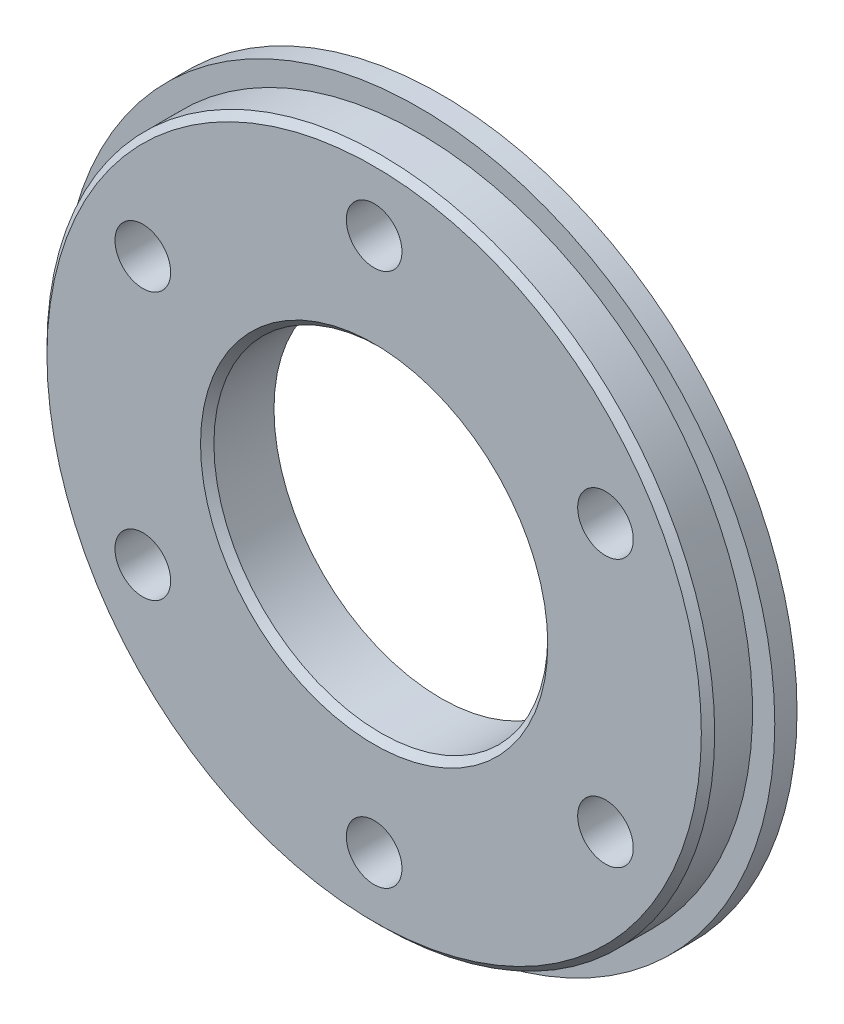
ISO-10303-21;
HEADER;
FILE_DESCRIPTION(('STEP AP214'),'2;1');
FILE_NAME('part.step','',(''),(''),'','','');
FILE_SCHEMA(('AUTOMOTIVE_DESIGN { 1 0 10303 214 1 1 1 1 }'));
ENDSEC;
DATA;
#1=APPLICATION_CONTEXT('core data for automotive mechanical design processes');
#2=APPLICATION_PROTOCOL_DEFINITION('international standard','automotive_design',2000,#1);
#3=PRODUCT_CONTEXT('',#1,'mechanical');
#4=PRODUCT('Part','Part','',(#3));
#5=PRODUCT_RELATED_PRODUCT_CATEGORY('part','',(#4));
#6=PRODUCT_DEFINITION_FORMATION('','',#4);
#7=PRODUCT_DEFINITION_CONTEXT('part definition',#1,'design');
#8=PRODUCT_DEFINITION('design','',#6,#7);
#9=PRODUCT_DEFINITION_SHAPE('','',#8);
#10=(LENGTH_UNIT() NAMED_UNIT(*) SI_UNIT(.MILLI.,.METRE.));
#11=(NAMED_UNIT(*) PLANE_ANGLE_UNIT() SI_UNIT($,.RADIAN.));
#12=(NAMED_UNIT(*) SI_UNIT($,.STERADIAN.) SOLID_ANGLE_UNIT());
#13=UNCERTAINTY_MEASURE_WITH_UNIT(LENGTH_MEASURE(1.E-05),#10,'distance_accuracy_value','');
#14=(GEOMETRIC_REPRESENTATION_CONTEXT(3) GLOBAL_UNCERTAINTY_ASSIGNED_CONTEXT((#13)) GLOBAL_UNIT_ASSIGNED_CONTEXT((#10,
#11,#12)) REPRESENTATION_CONTEXT('',''));
#15=CARTESIAN_POINT('',(0.,0.,0.));
#16=DIRECTION('',(0.,0.,1.));
#17=DIRECTION('',(1.,0.,0.));
#18=AXIS2_PLACEMENT_3D('',#15,#16,#17);
#19=CARTESIAN_POINT('',(0.,0.,0.));
#20=DIRECTION('',(0.,0.,1.));
#21=DIRECTION('',(1.,0.,0.));
#22=AXIS2_PLACEMENT_3D('',#19,#20,#21);
#23=PLANE('',#22);
#24=CARTESIAN_POINT('',(0.,12.,0.));
#25=DIRECTION('',(0.,0.,-1.));
#26=DIRECTION('',(-1.,0.,0.));
#27=AXIS2_PLACEMENT_3D('',#24,#25,#26);
#28=CIRCLE('',#27,1.24999999999999);
#29=CARTESIAN_POINT('',(-1.24999999999999,12.,0.));
#30=VERTEX_POINT('',#29);
#31=EDGE_CURVE('E133',#30,#30,#28,.T.);
#32=ORIENTED_EDGE('',*,*,#31,.F.);
#33=EDGE_LOOP('',(#32));
#34=FACE_BOUND('',#33,.T.);
#35=CARTESIAN_POINT('',(-10.3923048454133,5.99999999999998,0.));
#36=DIRECTION('',(0.,0.,-1.));
#37=DIRECTION('',(-1.,0.,0.));
#38=AXIS2_PLACEMENT_3D('',#35,#36,#37);
#39=CIRCLE('',#38,1.24999999999999);
#40=CARTESIAN_POINT('',(-11.6423048454133,5.99999999999998,0.));
#41=VERTEX_POINT('',#40);
#42=EDGE_CURVE('E125',#41,#41,#39,.T.);
#43=ORIENTED_EDGE('',*,*,#42,.F.);
#44=EDGE_LOOP('',(#43));
#45=FACE_BOUND('',#44,.T.);
#46=CARTESIAN_POINT('',(0.,-12.,0.));
#47=DIRECTION('',(0.,0.,-1.));
#48=DIRECTION('',(-1.,0.,0.));
#49=AXIS2_PLACEMENT_3D('',#46,#47,#48);
#50=CIRCLE('',#49,1.24999999999999);
#51=CARTESIAN_POINT('',(-1.2499999999999,-12.,0.));
#52=VERTEX_POINT('',#51);
#53=EDGE_CURVE('E109',#52,#52,#50,.T.);
#54=ORIENTED_EDGE('',*,*,#53,.F.);
#55=EDGE_LOOP('',(#54));
#56=FACE_BOUND('',#55,.T.);
#57=CARTESIAN_POINT('',(10.3923048454133,-5.99999999999991,0.));
#58=DIRECTION('',(0.,0.,-1.));
#59=DIRECTION('',(-1.,0.,0.));
#60=AXIS2_PLACEMENT_3D('',#57,#58,#59);
#61=CIRCLE('',#60,1.24999999999999);
#62=CARTESIAN_POINT('',(9.14230484541333,-5.99999999999991,0.));
#63=VERTEX_POINT('',#62);
#64=EDGE_CURVE('E101',#63,#63,#61,.T.);
#65=ORIENTED_EDGE('',*,*,#64,.F.);
#66=EDGE_LOOP('',(#65));
#67=FACE_BOUND('',#66,.T.);
#68=CARTESIAN_POINT('',(10.3923048454133,5.99999999999999,0.));
#69=DIRECTION('',(0.,0.,-1.));
#70=DIRECTION('',(-1.,0.,0.));
#71=AXIS2_PLACEMENT_3D('',#68,#69,#70);
#72=CIRCLE('',#71,1.24999999999999);
#73=CARTESIAN_POINT('',(9.14230484541328,5.99999999999999,0.));
#74=VERTEX_POINT('',#73);
#75=EDGE_CURVE('E93',#74,#74,#72,.T.);
#76=ORIENTED_EDGE('',*,*,#75,.F.);
#77=EDGE_LOOP('',(#76));
#78=FACE_BOUND('',#77,.T.);
#79=CARTESIAN_POINT('',(0.,0.,0.));
#80=DIRECTION('',(0.,0.,-1.));
#81=DIRECTION('',(-1.,0.,0.));
#82=AXIS2_PLACEMENT_3D('',#79,#80,#81);
#83=CIRCLE('',#82,7.5);
#84=CARTESIAN_POINT('',(-7.5,0.,0.));
#85=VERTEX_POINT('',#84);
#86=EDGE_CURVE('E82',#85,#85,#83,.T.);
#87=ORIENTED_EDGE('',*,*,#86,.F.);
#88=EDGE_LOOP('',(#87));
#89=FACE_BOUND('',#88,.T.);
#90=CARTESIAN_POINT('',(0.,0.,0.));
#91=DIRECTION('',(0.,0.,-1.));
#92=DIRECTION('',(-1.,0.,0.));
#93=AXIS2_PLACEMENT_3D('',#90,#91,#92);
#94=CIRCLE('',#93,16.);
#95=CARTESIAN_POINT('',(-16.,0.,0.));
#96=VERTEX_POINT('',#95);
#97=EDGE_CURVE('E78',#96,#96,#94,.T.);
#98=ORIENTED_EDGE('',*,*,#97,.T.);
#99=EDGE_LOOP('',(#98));
#100=FACE_BOUND('',#99,.T.);
#101=CARTESIAN_POINT('',(-10.3923048454132,-6.00000000000005,0.));
#102=DIRECTION('',(0.,0.,-1.));
#103=DIRECTION('',(-1.,0.,0.));
#104=AXIS2_PLACEMENT_3D('',#101,#102,#103);
#105=CIRCLE('',#104,1.24999999999999);
#106=CARTESIAN_POINT('',(-11.6423048454132,-6.00000000000005,0.));
#107=VERTEX_POINT('',#106);
#108=EDGE_CURVE('E117',#107,#107,#105,.T.);
#109=ORIENTED_EDGE('',*,*,#108,.F.);
#110=EDGE_LOOP('',(#109));
#111=FACE_BOUND('',#110,.T.);
#112=ADVANCED_FACE('F46',(#34,#45,#56,#67,#78,#89,#100,#111),#23,.F.);
#113=CARTESIAN_POINT('',(0.,0.,3.));
#114=DIRECTION('',(0.,0.,-1.));
#115=DIRECTION('',(-1.,0.,0.));
#116=AXIS2_PLACEMENT_3D('',#113,#114,#115);
#117=CYLINDRICAL_SURFACE('',#116,15.);
#118=CARTESIAN_POINT('',(0.,0.,2.69999999999999));
#119=DIRECTION('',(0.,0.,1.));
#120=DIRECTION('',(1.,0.,0.));
#121=AXIS2_PLACEMENT_3D('',#118,#119,#120);
#122=CIRCLE('',#121,15.);
#123=CARTESIAN_POINT('',(15.,0.,2.69999999999999));
#124=VERTEX_POINT('',#123);
#125=EDGE_CURVE('E61',#124,#124,#122,.F.);
#126=ORIENTED_EDGE('',*,*,#125,.T.);
#127=EDGE_LOOP('',(#126));
#128=FACE_BOUND('',#127,.T.);
#129=CARTESIAN_POINT('',(0.,0.,1.));
#130=DIRECTION('',(0.,0.,-1.));
#131=DIRECTION('',(-1.,0.,0.));
#132=AXIS2_PLACEMENT_3D('',#129,#130,#131);
#133=CIRCLE('',#132,15.);
#134=CARTESIAN_POINT('',(-15.,0.,1.));
#135=VERTEX_POINT('',#134);
#136=EDGE_CURVE('E73',#135,#135,#133,.T.);
#137=ORIENTED_EDGE('',*,*,#136,.F.);
#138=EDGE_LOOP('',(#137));
#139=FACE_BOUND('',#138,.T.);
#140=ADVANCED_FACE('F143',(#128,#139),#117,.T.);
#141=CARTESIAN_POINT('',(0.,0.,3.));
#142=DIRECTION('',(0.,0.,1.));
#143=DIRECTION('',(1.,0.,0.));
#144=AXIS2_PLACEMENT_3D('',#141,#142,#143);
#145=PLANE('',#144);
#146=CARTESIAN_POINT('',(0.,0.,3.));
#147=DIRECTION('',(0.,0.,1.));
#148=DIRECTION('',(1.,0.,0.));
#149=AXIS2_PLACEMENT_3D('',#146,#147,#148);
#150=CIRCLE('',#149,7.79999999999999);
#151=CARTESIAN_POINT('',(7.79999999999999,0.,3.));
#152=VERTEX_POINT('',#151);
#153=EDGE_CURVE('E10',#152,#152,#150,.F.);
#154=ORIENTED_EDGE('',*,*,#153,.T.);
#155=EDGE_LOOP('',(#154));
#156=FACE_BOUND('',#155,.T.);
#157=CARTESIAN_POINT('',(0.,0.,3.));
#158=DIRECTION('',(0.,0.,1.));
#159=DIRECTION('',(1.,0.,0.));
#160=AXIS2_PLACEMENT_3D('',#157,#158,#159);
#161=CIRCLE('',#160,14.7);
#162=CARTESIAN_POINT('',(14.7,0.,3.));
#163=VERTEX_POINT('',#162);
#164=EDGE_CURVE('E67',#163,#163,#161,.T.);
#165=ORIENTED_EDGE('',*,*,#164,.T.);
#166=EDGE_LOOP('',(#165));
#167=FACE_BOUND('',#166,.T.);
#168=CARTESIAN_POINT('',(0.,12.,3.));
#169=DIRECTION('',(0.,0.,-1.));
#170=DIRECTION('',(-1.,0.,0.));
#171=AXIS2_PLACEMENT_3D('',#168,#169,#170);
#172=CIRCLE('',#171,1.25);
#173=CARTESIAN_POINT('',(-1.25,12.,3.));
#174=VERTEX_POINT('',#173);
#175=EDGE_CURVE('E129',#174,#174,#172,.T.);
#176=ORIENTED_EDGE('',*,*,#175,.T.);
#177=EDGE_LOOP('',(#176));
#178=FACE_BOUND('',#177,.T.);
#179=CARTESIAN_POINT('',(-10.3923048454133,5.99999999999998,3.));
#180=DIRECTION('',(0.,0.,-1.));
#181=DIRECTION('',(-1.,0.,0.));
#182=AXIS2_PLACEMENT_3D('',#179,#180,#181);
#183=CIRCLE('',#182,1.25);
#184=CARTESIAN_POINT('',(-11.6423048454133,5.99999999999998,3.));
#185=VERTEX_POINT('',#184);
#186=EDGE_CURVE('E121',#185,#185,#183,.T.);
#187=ORIENTED_EDGE('',*,*,#186,.T.);
#188=EDGE_LOOP('',(#187));
#189=FACE_BOUND('',#188,.T.);
#190=CARTESIAN_POINT('',(-10.3923048454132,-6.00000000000005,3.));
#191=DIRECTION('',(0.,0.,-1.));
#192=DIRECTION('',(-1.,0.,0.));
#193=AXIS2_PLACEMENT_3D('',#190,#191,#192);
#194=CIRCLE('',#193,1.25);
#195=CARTESIAN_POINT('',(-11.6423048454132,-6.00000000000005,3.));
#196=VERTEX_POINT('',#195);
#197=EDGE_CURVE('E113',#196,#196,#194,.T.);
#198=ORIENTED_EDGE('',*,*,#197,.T.);
#199=EDGE_LOOP('',(#198));
#200=FACE_BOUND('',#199,.T.);
#201=CARTESIAN_POINT('',(0.,-12.,3.));
#202=DIRECTION('',(0.,0.,-1.));
#203=DIRECTION('',(-1.,0.,0.));
#204=AXIS2_PLACEMENT_3D('',#201,#202,#203);
#205=CIRCLE('',#204,1.25);
#206=CARTESIAN_POINT('',(-1.24999999999992,-12.,3.));
#207=VERTEX_POINT('',#206);
#208=EDGE_CURVE('E105',#207,#207,#205,.T.);
#209=ORIENTED_EDGE('',*,*,#208,.T.);
#210=EDGE_LOOP('',(#209));
#211=FACE_BOUND('',#210,.T.);
#212=CARTESIAN_POINT('',(10.3923048454133,-5.99999999999991,3.));
#213=DIRECTION('',(0.,0.,-1.));
#214=DIRECTION('',(-1.,0.,0.));
#215=AXIS2_PLACEMENT_3D('',#212,#213,#214);
#216=CIRCLE('',#215,1.25);
#217=CARTESIAN_POINT('',(9.14230484541332,-5.99999999999991,3.));
#218=VERTEX_POINT('',#217);
#219=EDGE_CURVE('E97',#218,#218,#216,.T.);
#220=ORIENTED_EDGE('',*,*,#219,.T.);
#221=EDGE_LOOP('',(#220));
#222=FACE_BOUND('',#221,.T.);
#223=CARTESIAN_POINT('',(10.3923048454133,5.99999999999999,3.));
#224=DIRECTION('',(0.,0.,-1.));
#225=DIRECTION('',(-1.,0.,0.));
#226=AXIS2_PLACEMENT_3D('',#223,#224,#225);
#227=CIRCLE('',#226,1.25);
#228=CARTESIAN_POINT('',(9.14230484541327,5.99999999999999,3.));
#229=VERTEX_POINT('',#228);
#230=EDGE_CURVE('E89',#229,#229,#227,.T.);
#231=ORIENTED_EDGE('',*,*,#230,.T.);
#232=EDGE_LOOP('',(#231));
#233=FACE_BOUND('',#232,.T.);
#234=ADVANCED_FACE('F194',(#156,#167,#178,#189,#200,#211,#222,#233),#145,.T.);
#235=CARTESIAN_POINT('',(0.,0.,1.));
#236=DIRECTION('',(0.,0.,-1.));
#237=DIRECTION('',(-1.,0.,0.));
#238=AXIS2_PLACEMENT_3D('',#235,#236,#237);
#239=CYLINDRICAL_SURFACE('',#238,16.);
#240=CARTESIAN_POINT('',(0.,0.,1.));
#241=DIRECTION('',(0.,0.,-1.));
#242=DIRECTION('',(-1.,0.,0.));
#243=AXIS2_PLACEMENT_3D('',#240,#241,#242);
#244=CIRCLE('',#243,16.);
#245=CARTESIAN_POINT('',(-16.,0.,1.));
#246=VERTEX_POINT('',#245);
#247=EDGE_CURVE('E77',#246,#246,#244,.T.);
#248=ORIENTED_EDGE('',*,*,#247,.T.);
#249=EDGE_LOOP('',(#248));
#250=FACE_BOUND('',#249,.T.);
#251=ORIENTED_EDGE('',*,*,#97,.F.);
#252=EDGE_LOOP('',(#251));
#253=FACE_BOUND('',#252,.T.);
#254=ADVANCED_FACE('F190',(#250,#253),#239,.T.);
#255=CARTESIAN_POINT('',(0.,0.,1.));
#256=DIRECTION('',(0.,0.,-1.));
#257=DIRECTION('',(-1.,0.,0.));
#258=AXIS2_PLACEMENT_3D('',#255,#256,#257);
#259=PLANE('',#258);
#260=ORIENTED_EDGE('',*,*,#136,.T.);
#261=EDGE_LOOP('',(#260));
#262=FACE_BOUND('',#261,.T.);
#263=ORIENTED_EDGE('',*,*,#247,.F.);
#264=EDGE_LOOP('',(#263));
#265=FACE_BOUND('',#264,.T.);
#266=ADVANCED_FACE('F187',(#262,#265),#259,.F.);
#267=CARTESIAN_POINT('',(0.,0.,9.));
#268=DIRECTION('',(0.,0.,-1.));
#269=DIRECTION('',(-1.,0.,0.));
#270=AXIS2_PLACEMENT_3D('',#267,#268,#269);
#271=CYLINDRICAL_SURFACE('',#270,7.5);
#272=CARTESIAN_POINT('',(0.,0.,2.70000000000001));
#273=DIRECTION('',(0.,0.,1.));
#274=DIRECTION('',(1.,0.,0.));
#275=AXIS2_PLACEMENT_3D('',#272,#273,#274);
#276=CIRCLE('',#275,7.5);
#277=CARTESIAN_POINT('',(7.5,0.,2.70000000000001));
#278=VERTEX_POINT('',#277);
#279=EDGE_CURVE('E55',#278,#278,#276,.T.);
#280=ORIENTED_EDGE('',*,*,#279,.T.);
#281=EDGE_LOOP('',(#280));
#282=FACE_BOUND('',#281,.T.);
#283=ORIENTED_EDGE('',*,*,#86,.T.);
#284=EDGE_LOOP('',(#283));
#285=FACE_BOUND('',#284,.T.);
#286=ADVANCED_FACE('F183',(#282,#285),#271,.F.);
#287=CARTESIAN_POINT('',(10.3923048454133,5.99999999999999,0.));
#288=DIRECTION('',(0.,0.,-1.));
#289=DIRECTION('',(-1.,0.,0.));
#290=AXIS2_PLACEMENT_3D('',#287,#288,#289);
#291=CYLINDRICAL_SURFACE('',#290,1.24999999999999);
#292=ORIENTED_EDGE('',*,*,#230,.F.);
#293=EDGE_LOOP('',(#292));
#294=FACE_BOUND('',#293,.T.);
#295=ORIENTED_EDGE('',*,*,#75,.T.);
#296=EDGE_LOOP('',(#295));
#297=FACE_BOUND('',#296,.T.);
#298=ADVANCED_FACE('F179',(#294,#297),#291,.F.);
#299=CARTESIAN_POINT('',(10.3923048454133,-5.99999999999991,0.));
#300=DIRECTION('',(0.,0.,-1.));
#301=DIRECTION('',(-1.,0.,0.));
#302=AXIS2_PLACEMENT_3D('',#299,#300,#301);
#303=CYLINDRICAL_SURFACE('',#302,1.24999999999999);
#304=ORIENTED_EDGE('',*,*,#219,.F.);
#305=EDGE_LOOP('',(#304));
#306=FACE_BOUND('',#305,.T.);
#307=ORIENTED_EDGE('',*,*,#64,.T.);
#308=EDGE_LOOP('',(#307));
#309=FACE_BOUND('',#308,.T.);
#310=ADVANCED_FACE('F171',(#306,#309),#303,.F.);
#311=CARTESIAN_POINT('',(0.,-12.,0.));
#312=DIRECTION('',(0.,0.,-1.));
#313=DIRECTION('',(-1.,0.,0.));
#314=AXIS2_PLACEMENT_3D('',#311,#312,#313);
#315=CYLINDRICAL_SURFACE('',#314,1.24999999999999);
#316=ORIENTED_EDGE('',*,*,#208,.F.);
#317=EDGE_LOOP('',(#316));
#318=FACE_BOUND('',#317,.T.);
#319=ORIENTED_EDGE('',*,*,#53,.T.);
#320=EDGE_LOOP('',(#319));
#321=FACE_BOUND('',#320,.T.);
#322=ADVANCED_FACE('F162',(#318,#321),#315,.F.);
#323=CARTESIAN_POINT('',(-10.3923048454132,-6.00000000000005,0.));
#324=DIRECTION('',(0.,0.,-1.));
#325=DIRECTION('',(-1.,0.,0.));
#326=AXIS2_PLACEMENT_3D('',#323,#324,#325);
#327=CYLINDRICAL_SURFACE('',#326,1.24999999999999);
#328=ORIENTED_EDGE('',*,*,#197,.F.);
#329=EDGE_LOOP('',(#328));
#330=FACE_BOUND('',#329,.T.);
#331=ORIENTED_EDGE('',*,*,#108,.T.);
#332=EDGE_LOOP('',(#331));
#333=FACE_BOUND('',#332,.T.);
#334=ADVANCED_FACE('F159',(#330,#333),#327,.F.);
#335=CARTESIAN_POINT('',(-10.3923048454133,5.99999999999998,0.));
#336=DIRECTION('',(0.,0.,-1.));
#337=DIRECTION('',(-1.,0.,0.));
#338=AXIS2_PLACEMENT_3D('',#335,#336,#337);
#339=CYLINDRICAL_SURFACE('',#338,1.24999999999999);
#340=ORIENTED_EDGE('',*,*,#186,.F.);
#341=EDGE_LOOP('',(#340));
#342=FACE_BOUND('',#341,.T.);
#343=ORIENTED_EDGE('',*,*,#42,.T.);
#344=EDGE_LOOP('',(#343));
#345=FACE_BOUND('',#344,.T.);
#346=ADVANCED_FACE('F161',(#342,#345),#339,.F.);
#347=CARTESIAN_POINT('',(0.,12.,0.));
#348=DIRECTION('',(0.,0.,-1.));
#349=DIRECTION('',(-1.,0.,0.));
#350=AXIS2_PLACEMENT_3D('',#347,#348,#349);
#351=CYLINDRICAL_SURFACE('',#350,1.24999999999999);
#352=ORIENTED_EDGE('',*,*,#175,.F.);
#353=EDGE_LOOP('',(#352));
#354=FACE_BOUND('',#353,.T.);
#355=ORIENTED_EDGE('',*,*,#31,.T.);
#356=EDGE_LOOP('',(#355));
#357=FACE_BOUND('',#356,.T.);
#358=ADVANCED_FACE('F139',(#354,#357),#351,.F.);
#359=CARTESIAN_POINT('',(0.,0.,3.));
#360=DIRECTION('',(0.,0.,-1.));
#361=DIRECTION('',(-1.,0.,0.));
#362=AXIS2_PLACEMENT_3D('',#359,#360,#361);
#363=CONICAL_SURFACE('',#362,14.7,0.785398163397451);
#364=ORIENTED_EDGE('',*,*,#125,.F.);
#365=EDGE_LOOP('',(#364));
#366=FACE_BOUND('',#365,.T.);
#367=ORIENTED_EDGE('',*,*,#164,.F.);
#368=EDGE_LOOP('',(#367));
#369=FACE_BOUND('',#368,.T.);
#370=ADVANCED_FACE('F201',(#366,#369),#363,.T.);
#371=CARTESIAN_POINT('',(0.,0.,2.70000000000001));
#372=DIRECTION('',(0.,0.,1.));
#373=DIRECTION('',(1.,0.,0.));
#374=AXIS2_PLACEMENT_3D('',#371,#372,#373);
#375=CONICAL_SURFACE('',#374,7.5,0.785398163397456);
#376=ORIENTED_EDGE('',*,*,#153,.F.);
#377=EDGE_LOOP('',(#376));
#378=FACE_BOUND('',#377,.T.);
#379=ORIENTED_EDGE('',*,*,#279,.F.);
#380=EDGE_LOOP('',(#379));
#381=FACE_BOUND('',#380,.T.);
#382=ADVANCED_FACE('F49',(#378,#381),#375,.F.);
#383=CLOSED_SHELL('',(#112,#140,#234,#254,#266,#286,#298,#310,#322,#334,#346,#358,#370,#382));
#384=MANIFOLD_SOLID_BREP('B2',#383);
#385=ADVANCED_BREP_SHAPE_REPRESENTATION('',(#18,#384),#14);
#386=SHAPE_DEFINITION_REPRESENTATION(#9,#385);
ENDSEC;
END-ISO-10303-21;
